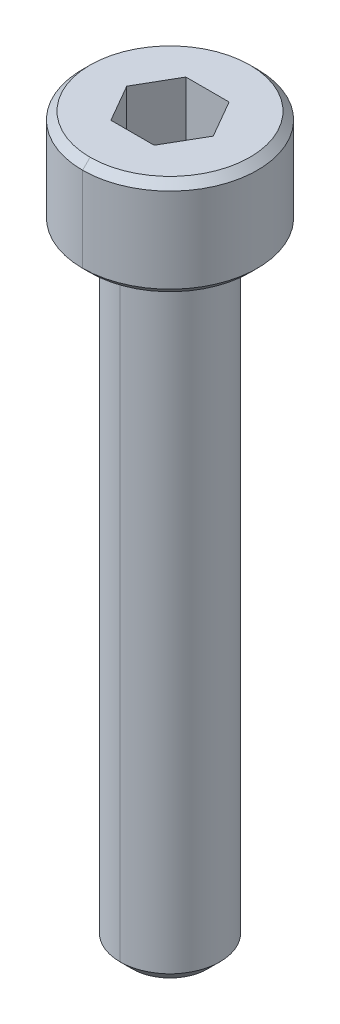
ISO-10303-21;
HEADER;
FILE_DESCRIPTION(('STEP AP214'),'2;1');
FILE_NAME('part.step','',(''),(''),'','','');
FILE_SCHEMA(('AUTOMOTIVE_DESIGN { 1 0 10303 214 1 1 1 1 }'));
ENDSEC;
DATA;
#1=APPLICATION_CONTEXT('core data for automotive mechanical design processes');
#2=APPLICATION_PROTOCOL_DEFINITION('international standard','automotive_design',2000,#1);
#3=PRODUCT_CONTEXT('',#1,'mechanical');
#4=PRODUCT('Part','Part','',(#3));
#5=PRODUCT_RELATED_PRODUCT_CATEGORY('part','',(#4));
#6=PRODUCT_DEFINITION_FORMATION('','',#4);
#7=PRODUCT_DEFINITION_CONTEXT('part definition',#1,'design');
#8=PRODUCT_DEFINITION('design','',#6,#7);
#9=PRODUCT_DEFINITION_SHAPE('','',#8);
#10=(LENGTH_UNIT() NAMED_UNIT(*) SI_UNIT(.MILLI.,.METRE.));
#11=(NAMED_UNIT(*) PLANE_ANGLE_UNIT() SI_UNIT($,.RADIAN.));
#12=(NAMED_UNIT(*) SI_UNIT($,.STERADIAN.) SOLID_ANGLE_UNIT());
#13=UNCERTAINTY_MEASURE_WITH_UNIT(LENGTH_MEASURE(1.E-05),#10,'distance_accuracy_value','');
#14=(GEOMETRIC_REPRESENTATION_CONTEXT(3) GLOBAL_UNCERTAINTY_ASSIGNED_CONTEXT((#13)) GLOBAL_UNIT_ASSIGNED_CONTEXT((#10,
#11,#12)) REPRESENTATION_CONTEXT('',''));
#15=CARTESIAN_POINT('',(0.,0.,0.));
#16=DIRECTION('',(0.,0.,1.));
#17=DIRECTION('',(1.,0.,0.));
#18=AXIS2_PLACEMENT_3D('',#15,#16,#17);
#19=CARTESIAN_POINT('',(0.866025403784439,26.,1.5));
#20=DIRECTION('',(0.866025403784439,0.,0.5));
#21=DIRECTION('',(0.5,0.,-0.866025403784439));
#22=AXIS2_PLACEMENT_3D('',#19,#20,#21);
#23=PLANE('',#22);
#24=DIRECTION('',(0.5,0.,-0.866025403784439));
#25=VECTOR('',#24,1.);
#26=CARTESIAN_POINT('',(0.866025403784439,26.,1.5));
#27=LINE('',#26,#25);
#28=CARTESIAN_POINT('',(0.866025403784439,26.,1.5));
#29=VERTEX_POINT('',#28);
#30=CARTESIAN_POINT('',(1.73205080756888,26.,0.));
#31=VERTEX_POINT('',#30);
#32=EDGE_CURVE('E179',#29,#31,#27,.T.);
#33=ORIENTED_EDGE('',*,*,#32,.F.);
#34=DIRECTION('',(0.,1.,0.));
#35=VECTOR('',#34,1.);
#36=CARTESIAN_POINT('',(0.866025403784439,26.,1.5));
#37=LINE('',#36,#35);
#38=CARTESIAN_POINT('',(0.866025403784439,29.,1.5));
#39=VERTEX_POINT('',#38);
#40=EDGE_CURVE('E167',#29,#39,#37,.T.);
#41=ORIENTED_EDGE('',*,*,#40,.T.);
#42=DIRECTION('',(0.5,0.,-0.866025403784439));
#43=VECTOR('',#42,1.);
#44=CARTESIAN_POINT('',(0.866025403784439,29.,1.5));
#45=LINE('',#44,#43);
#46=CARTESIAN_POINT('',(1.73205080756888,29.,0.));
#47=VERTEX_POINT('',#46);
#48=EDGE_CURVE('E181',#47,#39,#45,.F.);
#49=ORIENTED_EDGE('',*,*,#48,.F.);
#50=DIRECTION('',(0.,1.,0.));
#51=VECTOR('',#50,1.);
#52=CARTESIAN_POINT('',(1.73205080756888,26.,0.));
#53=LINE('',#52,#51);
#54=EDGE_CURVE('E174',#47,#31,#53,.F.);
#55=ORIENTED_EDGE('',*,*,#54,.T.);
#56=EDGE_LOOP('',(#33,#41,#49,#55));
#57=FACE_BOUND('',#56,.T.);
#58=ADVANCED_FACE('F17',(#57),#23,.F.);
#59=CARTESIAN_POINT('',(1.73205080756888,26.,0.));
#60=DIRECTION('',(0.866025403784438,0.,-0.5));
#61=DIRECTION('',(-0.5,0.,-0.866025403784438));
#62=AXIS2_PLACEMENT_3D('',#59,#60,#61);
#63=PLANE('',#62);
#64=DIRECTION('',(-0.5,0.,-0.866025403784438));
#65=VECTOR('',#64,1.);
#66=CARTESIAN_POINT('',(1.73205080756888,26.,0.));
#67=LINE('',#66,#65);
#68=CARTESIAN_POINT('',(0.866025403784438,26.,-1.5));
#69=VERTEX_POINT('',#68);
#70=EDGE_CURVE('E172',#31,#69,#67,.T.);
#71=ORIENTED_EDGE('',*,*,#70,.F.);
#72=ORIENTED_EDGE('',*,*,#54,.F.);
#73=DIRECTION('',(-0.5,0.,-0.866025403784438));
#74=VECTOR('',#73,1.);
#75=CARTESIAN_POINT('',(1.73205080756888,29.,0.));
#76=LINE('',#75,#74);
#77=CARTESIAN_POINT('',(0.866025403784439,29.,-1.5));
#78=VERTEX_POINT('',#77);
#79=EDGE_CURVE('E177',#78,#47,#76,.F.);
#80=ORIENTED_EDGE('',*,*,#79,.F.);
#81=DIRECTION('',(0.,1.,0.));
#82=VECTOR('',#81,1.);
#83=CARTESIAN_POINT('',(0.866025403784438,26.,-1.5));
#84=LINE('',#83,#82);
#85=EDGE_CURVE('E162',#78,#69,#84,.F.);
#86=ORIENTED_EDGE('',*,*,#85,.T.);
#87=EDGE_LOOP('',(#71,#72,#80,#86));
#88=FACE_BOUND('',#87,.T.);
#89=ADVANCED_FACE('F417',(#88),#63,.F.);
#90=CARTESIAN_POINT('',(-0.866025403784438,26.,1.5));
#91=DIRECTION('',(0.,0.,1.));
#92=DIRECTION('',(1.,0.,0.));
#93=AXIS2_PLACEMENT_3D('',#90,#91,#92);
#94=PLANE('',#93);
#95=DIRECTION('',(1.,0.,0.));
#96=VECTOR('',#95,1.);
#97=CARTESIAN_POINT('',(1.73205080756888,26.,1.5));
#98=LINE('',#97,#96);
#99=CARTESIAN_POINT('',(-0.866025403784438,26.,1.5));
#100=VERTEX_POINT('',#99);
#101=EDGE_CURVE('E159',#100,#29,#98,.T.);
#102=ORIENTED_EDGE('',*,*,#101,.F.);
#103=DIRECTION('',(0.,1.,0.));
#104=VECTOR('',#103,1.);
#105=CARTESIAN_POINT('',(-0.866025403784438,26.,1.5));
#106=LINE('',#105,#104);
#107=CARTESIAN_POINT('',(-0.866025403784438,29.,1.5));
#108=VERTEX_POINT('',#107);
#109=EDGE_CURVE('E148',#100,#108,#106,.T.);
#110=ORIENTED_EDGE('',*,*,#109,.T.);
#111=DIRECTION('',(1.,0.,0.));
#112=VECTOR('',#111,1.);
#113=CARTESIAN_POINT('',(-0.866025403784438,29.,1.5));
#114=LINE('',#113,#112);
#115=EDGE_CURVE('E170',#39,#108,#114,.F.);
#116=ORIENTED_EDGE('',*,*,#115,.F.);
#117=ORIENTED_EDGE('',*,*,#40,.F.);
#118=EDGE_LOOP('',(#102,#110,#116,#117));
#119=FACE_BOUND('',#118,.T.);
#120=ADVANCED_FACE('F408',(#119),#94,.F.);
#121=CARTESIAN_POINT('',(0.866025403784438,26.,-1.5));
#122=DIRECTION('',(0.,0.,-1.));
#123=DIRECTION('',(-1.,0.,0.));
#124=AXIS2_PLACEMENT_3D('',#121,#122,#123);
#125=PLANE('',#124);
#126=DIRECTION('',(1.,0.,0.));
#127=VECTOR('',#126,1.);
#128=CARTESIAN_POINT('',(1.73205080756888,26.,-1.5));
#129=LINE('',#128,#127);
#130=CARTESIAN_POINT('',(-0.866025403784438,26.,-1.5));
#131=VERTEX_POINT('',#130);
#132=EDGE_CURVE('E156',#69,#131,#129,.F.);
#133=ORIENTED_EDGE('',*,*,#132,.F.);
#134=ORIENTED_EDGE('',*,*,#85,.F.);
#135=DIRECTION('',(-1.,0.,0.));
#136=VECTOR('',#135,1.);
#137=CARTESIAN_POINT('',(0.866025403784438,29.,-1.5));
#138=LINE('',#137,#136);
#139=CARTESIAN_POINT('',(-0.866025403784438,29.,-1.5));
#140=VERTEX_POINT('',#139);
#141=EDGE_CURVE('E165',#140,#78,#138,.F.);
#142=ORIENTED_EDGE('',*,*,#141,.F.);
#143=DIRECTION('',(0.,1.,0.));
#144=VECTOR('',#143,1.);
#145=CARTESIAN_POINT('',(-0.866025403784438,26.,-1.5));
#146=LINE('',#145,#144);
#147=EDGE_CURVE('E146',#140,#131,#146,.F.);
#148=ORIENTED_EDGE('',*,*,#147,.T.);
#149=EDGE_LOOP('',(#133,#134,#142,#148));
#150=FACE_BOUND('',#149,.T.);
#151=ADVANCED_FACE('F399',(#150),#125,.F.);
#152=CARTESIAN_POINT('',(1.73205080756888,26.,0.));
#153=DIRECTION('',(0.,1.,0.));
#154=DIRECTION('',(0.,0.,1.));
#155=AXIS2_PLACEMENT_3D('',#152,#153,#154);
#156=PLANE('',#155);
#157=ORIENTED_EDGE('',*,*,#132,.T.);
#158=DIRECTION('',(-0.5,0.,0.866025403784439));
#159=VECTOR('',#158,1.);
#160=CARTESIAN_POINT('',(-0.866025403784438,26.,-1.5));
#161=LINE('',#160,#159);
#162=CARTESIAN_POINT('',(-1.73205080756888,26.,0.));
#163=VERTEX_POINT('',#162);
#164=EDGE_CURVE('E144',#131,#163,#161,.T.);
#165=ORIENTED_EDGE('',*,*,#164,.T.);
#166=DIRECTION('',(0.5,0.,0.866025403784439));
#167=VECTOR('',#166,1.);
#168=CARTESIAN_POINT('',(-1.73205080756888,26.,0.));
#169=LINE('',#168,#167);
#170=EDGE_CURVE('E151',#163,#100,#169,.T.);
#171=ORIENTED_EDGE('',*,*,#170,.T.);
#172=ORIENTED_EDGE('',*,*,#101,.T.);
#173=ORIENTED_EDGE('',*,*,#32,.T.);
#174=ORIENTED_EDGE('',*,*,#70,.T.);
#175=EDGE_LOOP('',(#157,#165,#171,#172,#173,#174));
#176=FACE_BOUND('',#175,.T.);
#177=ADVANCED_FACE('F390',(#176),#156,.T.);
#178=CARTESIAN_POINT('',(-1.73205080756888,26.,0.));
#179=DIRECTION('',(-0.866025403784439,0.,0.5));
#180=DIRECTION('',(0.5,0.,0.866025403784439));
#181=AXIS2_PLACEMENT_3D('',#178,#179,#180);
#182=PLANE('',#181);
#183=ORIENTED_EDGE('',*,*,#170,.F.);
#184=DIRECTION('',(0.,1.,0.));
#185=VECTOR('',#184,1.);
#186=CARTESIAN_POINT('',(-1.73205080756888,26.,0.));
#187=LINE('',#186,#185);
#188=CARTESIAN_POINT('',(-1.73205080756888,29.,0.));
#189=VERTEX_POINT('',#188);
#190=EDGE_CURVE('E141',#163,#189,#187,.T.);
#191=ORIENTED_EDGE('',*,*,#190,.T.);
#192=DIRECTION('',(0.5,0.,0.866025403784439));
#193=VECTOR('',#192,1.);
#194=CARTESIAN_POINT('',(-1.73205080756888,29.,0.));
#195=LINE('',#194,#193);
#196=EDGE_CURVE('E154',#108,#189,#195,.F.);
#197=ORIENTED_EDGE('',*,*,#196,.F.);
#198=ORIENTED_EDGE('',*,*,#109,.F.);
#199=EDGE_LOOP('',(#183,#191,#197,#198));
#200=FACE_BOUND('',#199,.T.);
#201=ADVANCED_FACE('F381',(#200),#182,.F.);
#202=CARTESIAN_POINT('',(-0.866025403784438,26.,-1.5));
#203=DIRECTION('',(-0.866025403784439,0.,-0.5));
#204=DIRECTION('',(-0.5,0.,0.866025403784439));
#205=AXIS2_PLACEMENT_3D('',#202,#203,#204);
#206=PLANE('',#205);
#207=ORIENTED_EDGE('',*,*,#164,.F.);
#208=ORIENTED_EDGE('',*,*,#147,.F.);
#209=DIRECTION('',(0.5,0.,-0.866025403784439));
#210=VECTOR('',#209,1.);
#211=CARTESIAN_POINT('',(-1.73205080756888,29.,0.));
#212=LINE('',#211,#210);
#213=EDGE_CURVE('E122',#189,#140,#212,.T.);
#214=ORIENTED_EDGE('',*,*,#213,.F.);
#215=ORIENTED_EDGE('',*,*,#190,.F.);
#216=EDGE_LOOP('',(#207,#208,#214,#215));
#217=FACE_BOUND('',#216,.T.);
#218=ADVANCED_FACE('F373',(#217),#206,.F.);
#219=CARTESIAN_POINT('',(0.,29.,-3.5));
#220=DIRECTION('',(0.,1.,0.));
#221=DIRECTION('',(0.,0.,1.));
#222=AXIS2_PLACEMENT_3D('',#219,#220,#221);
#223=PLANE('',#222);
#224=CARTESIAN_POINT('',(0.,29.0000000000532,0.));
#225=DIRECTION('',(0.,-1.,0.));
#226=DIRECTION('',(1.,0.,0.));
#227=AXIS2_PLACEMENT_3D('',#224,#225,#226);
#228=CIRCLE('',#227,3.19999999999254);
#229=CARTESIAN_POINT('',(0.,29.0000000000532,-3.19999999999254));
#230=VERTEX_POINT('',#229);
#231=CARTESIAN_POINT('',(0.,29.0000000000532,3.19999999999254));
#232=VERTEX_POINT('',#231);
#233=EDGE_CURVE('E111',#230,#232,#228,.T.);
#234=ORIENTED_EDGE('',*,*,#233,.F.);
#235=CARTESIAN_POINT('',(0.,29.0000000000532,0.));
#236=DIRECTION('',(0.,-1.,0.));
#237=DIRECTION('',(1.,0.,0.));
#238=AXIS2_PLACEMENT_3D('',#235,#236,#237);
#239=CIRCLE('',#238,3.19999999999254);
#240=EDGE_CURVE('E20',#232,#230,#239,.T.);
#241=ORIENTED_EDGE('',*,*,#240,.F.);
#242=EDGE_LOOP('',(#234,#241));
#243=FACE_BOUND('',#242,.T.);
#244=ORIENTED_EDGE('',*,*,#196,.T.);
#245=ORIENTED_EDGE('',*,*,#213,.T.);
#246=ORIENTED_EDGE('',*,*,#141,.T.);
#247=ORIENTED_EDGE('',*,*,#79,.T.);
#248=ORIENTED_EDGE('',*,*,#48,.T.);
#249=ORIENTED_EDGE('',*,*,#115,.T.);
#250=EDGE_LOOP('',(#244,#245,#246,#247,#248,#249));
#251=FACE_BOUND('',#250,.T.);
#252=ADVANCED_FACE('F112',(#243,#251),#223,.T.);
#253=CARTESIAN_POINT('',(0.,28.7000000000717,0.));
#254=DIRECTION('',(0.,-1.,0.));
#255=DIRECTION('',(1.,0.,0.));
#256=AXIS2_PLACEMENT_3D('',#253,#254,#255);
#257=CONICAL_SURFACE('',#256,3.49999999997408,0.785398163397448);
#258=DIRECTION('',(0.,0.707106781186548,0.707106781186548));
#259=VECTOR('',#258,1.);
#260=CARTESIAN_POINT('',(0.,-498967.8,-499000.));
#261=LINE('',#260,#259);
#262=CARTESIAN_POINT('',(0.,28.7000000000179,-3.49999999999352));
#263=VERTEX_POINT('',#262);
#264=EDGE_CURVE('E120',#263,#230,#261,.T.);
#265=ORIENTED_EDGE('',*,*,#264,.F.);
#266=CARTESIAN_POINT('',(0.,28.7,0.));
#267=DIRECTION('',(0.,-1.,0.));
#268=DIRECTION('',(0.,0.,-1.));
#269=AXIS2_PLACEMENT_3D('',#266,#267,#268);
#270=CIRCLE('',#269,3.5);
#271=CARTESIAN_POINT('',(0.,28.7000000000179,3.49999999999352));
#272=VERTEX_POINT('',#271);
#273=EDGE_CURVE('E127',#272,#263,#270,.T.);
#274=ORIENTED_EDGE('',*,*,#273,.F.);
#275=DIRECTION('',(0.,0.707106781186548,-0.707106781186548));
#276=VECTOR('',#275,1.);
#277=CARTESIAN_POINT('',(6.11098752774529E-11,-498967.8,499000.));
#278=LINE('',#277,#276);
#279=EDGE_CURVE('E117',#232,#272,#278,.F.);
#280=ORIENTED_EDGE('',*,*,#279,.F.);
#281=ORIENTED_EDGE('',*,*,#240,.T.);
#282=EDGE_LOOP('',(#265,#274,#280,#281));
#283=FACE_BOUND('',#282,.T.);
#284=ADVANCED_FACE('F119',(#283),#257,.T.);
#285=CARTESIAN_POINT('',(0.,28.7000000000717,0.));
#286=DIRECTION('',(0.,-1.,0.));
#287=DIRECTION('',(1.,0.,0.));
#288=AXIS2_PLACEMENT_3D('',#285,#286,#287);
#289=CONICAL_SURFACE('',#288,3.49999999997408,0.785398163397448);
#290=CARTESIAN_POINT('',(0.,28.7,0.));
#291=DIRECTION('',(0.,-1.,0.));
#292=DIRECTION('',(0.,0.,-1.));
#293=AXIS2_PLACEMENT_3D('',#290,#291,#292);
#294=CIRCLE('',#293,3.5);
#295=EDGE_CURVE('E125',#263,#272,#294,.T.);
#296=ORIENTED_EDGE('',*,*,#295,.F.);
#297=ORIENTED_EDGE('',*,*,#264,.T.);
#298=ORIENTED_EDGE('',*,*,#233,.T.);
#299=ORIENTED_EDGE('',*,*,#279,.T.);
#300=EDGE_LOOP('',(#296,#297,#298,#299));
#301=FACE_BOUND('',#300,.T.);
#302=ADVANCED_FACE('F123',(#301),#289,.T.);
#303=CARTESIAN_POINT('',(0.,0.,0.));
#304=DIRECTION('',(0.,-1.,0.));
#305=DIRECTION('',(0.,0.,-1.));
#306=AXIS2_PLACEMENT_3D('',#303,#304,#305);
#307=CYLINDRICAL_SURFACE('',#306,3.5);
#308=DIRECTION('',(0.,-1.,0.));
#309=VECTOR('',#308,1.);
#310=CARTESIAN_POINT('',(0.,0.,-3.5));
#311=LINE('',#310,#309);
#312=CARTESIAN_POINT('',(0.,25.2999999999375,-3.49999999996635));
#313=VERTEX_POINT('',#312);
#314=EDGE_CURVE('E226',#313,#263,#311,.F.);
#315=ORIENTED_EDGE('',*,*,#314,.F.);
#316=CARTESIAN_POINT('',(0.,25.2999999999588,0.));
#317=DIRECTION('',(0.,1.,0.));
#318=DIRECTION('',(0.,0.,1.));
#319=AXIS2_PLACEMENT_3D('',#316,#317,#318);
#320=CIRCLE('',#319,3.49999999997408);
#321=CARTESIAN_POINT('',(0.,25.2999999999588,3.49999999996635));
#322=VERTEX_POINT('',#321);
#323=EDGE_CURVE('E221',#322,#313,#320,.F.);
#324=ORIENTED_EDGE('',*,*,#323,.F.);
#325=DIRECTION('',(0.,-1.,0.));
#326=VECTOR('',#325,1.);
#327=CARTESIAN_POINT('',(0.,0.,3.5));
#328=LINE('',#327,#326);
#329=EDGE_CURVE('E231',#272,#322,#328,.T.);
#330=ORIENTED_EDGE('',*,*,#329,.F.);
#331=ORIENTED_EDGE('',*,*,#273,.T.);
#332=EDGE_LOOP('',(#315,#324,#330,#331));
#333=FACE_BOUND('',#332,.T.);
#334=ADVANCED_FACE('F246',(#333),#307,.T.);
#335=CARTESIAN_POINT('',(0.,0.,0.));
#336=DIRECTION('',(0.,-1.,0.));
#337=DIRECTION('',(0.,0.,-1.));
#338=AXIS2_PLACEMENT_3D('',#335,#336,#337);
#339=CYLINDRICAL_SURFACE('',#338,3.5);
#340=CARTESIAN_POINT('',(0.,25.2999999999588,0.));
#341=DIRECTION('',(0.,1.,0.));
#342=DIRECTION('',(0.,0.,1.));
#343=AXIS2_PLACEMENT_3D('',#340,#341,#342);
#344=CIRCLE('',#343,3.49999999997408);
#345=EDGE_CURVE('E206',#313,#322,#344,.F.);
#346=ORIENTED_EDGE('',*,*,#345,.F.);
#347=ORIENTED_EDGE('',*,*,#314,.T.);
#348=ORIENTED_EDGE('',*,*,#295,.T.);
#349=ORIENTED_EDGE('',*,*,#329,.T.);
#350=EDGE_LOOP('',(#346,#347,#348,#349));
#351=FACE_BOUND('',#350,.T.);
#352=ADVANCED_FACE('F243',(#351),#339,.T.);
#353=CARTESIAN_POINT('',(0.,25.299999999902,0.));
#354=DIRECTION('',(0.,1.,0.));
#355=DIRECTION('',(0.,0.,1.));
#356=AXIS2_PLACEMENT_3D('',#353,#354,#355);
#357=CONICAL_SURFACE('',#356,3.49999999991724,0.785398163397448);
#358=DIRECTION('',(0.,-0.707106781186548,-0.707106781186548));
#359=VECTOR('',#358,1.);
#360=CARTESIAN_POINT('',(0.,499000.,498978.2));
#361=LINE('',#360,#359);
#362=CARTESIAN_POINT('',(0.,24.9999999999773,3.19999999999254));
#363=VERTEX_POINT('',#362);
#364=EDGE_CURVE('E203',#322,#363,#361,.T.);
#365=ORIENTED_EDGE('',*,*,#364,.F.);
#366=ORIENTED_EDGE('',*,*,#323,.T.);
#367=DIRECTION('',(0.,-0.707106781186548,0.707106781186548));
#368=VECTOR('',#367,1.);
#369=CARTESIAN_POINT('',(6.11072055474308E-11,499000.,-498978.2));
#370=LINE('',#369,#368);
#371=CARTESIAN_POINT('',(0.,24.9999999999773,-3.19999999999254));
#372=VERTEX_POINT('',#371);
#373=EDGE_CURVE('E212',#372,#313,#370,.F.);
#374=ORIENTED_EDGE('',*,*,#373,.F.);
#375=CARTESIAN_POINT('',(0.,24.9999999999773,0.));
#376=DIRECTION('',(0.,1.,0.));
#377=DIRECTION('',(0.,0.,1.));
#378=AXIS2_PLACEMENT_3D('',#375,#376,#377);
#379=CIRCLE('',#378,3.19999999999254);
#380=EDGE_CURVE('E198',#363,#372,#379,.F.);
#381=ORIENTED_EDGE('',*,*,#380,.F.);
#382=EDGE_LOOP('',(#365,#366,#374,#381));
#383=FACE_BOUND('',#382,.T.);
#384=ADVANCED_FACE('F248',(#383),#357,.T.);
#385=CARTESIAN_POINT('',(0.,25.299999999902,0.));
#386=DIRECTION('',(0.,1.,0.));
#387=DIRECTION('',(0.,0.,1.));
#388=AXIS2_PLACEMENT_3D('',#385,#386,#387);
#389=CONICAL_SURFACE('',#388,3.49999999991724,0.785398163397448);
#390=ORIENTED_EDGE('',*,*,#345,.T.);
#391=ORIENTED_EDGE('',*,*,#364,.T.);
#392=CARTESIAN_POINT('',(0.,24.9999999999773,0.));
#393=DIRECTION('',(0.,1.,0.));
#394=DIRECTION('',(0.,0.,1.));
#395=AXIS2_PLACEMENT_3D('',#392,#393,#394);
#396=CIRCLE('',#395,3.19999999999254);
#397=EDGE_CURVE('E195',#372,#363,#396,.F.);
#398=ORIENTED_EDGE('',*,*,#397,.F.);
#399=ORIENTED_EDGE('',*,*,#373,.T.);
#400=EDGE_LOOP('',(#390,#391,#398,#399));
#401=FACE_BOUND('',#400,.T.);
#402=ADVANCED_FACE('F249',(#401),#389,.T.);
#403=CARTESIAN_POINT('',(0.,0.,0.));
#404=DIRECTION('',(0.,-1.,0.));
#405=DIRECTION('',(0.,0.,-1.));
#406=AXIS2_PLACEMENT_3D('',#403,#404,#405);
#407=PLANE('',#406);
#408=CARTESIAN_POINT('',(0.,5.68433104405908E-11,0.));
#409=DIRECTION('',(0.,1.,0.));
#410=DIRECTION('',(0.,0.,1.));
#411=AXIS2_PLACEMENT_3D('',#408,#409,#410);
#412=CIRCLE('',#411,1.50000000002137);
#413=CARTESIAN_POINT('',(0.,5.68433104405908E-11,1.50000000002137));
#414=VERTEX_POINT('',#413);
#415=CARTESIAN_POINT('',(0.,5.68433104405908E-11,-1.50000000002137));
#416=VERTEX_POINT('',#415);
#417=EDGE_CURVE('E191',#414,#416,#412,.T.);
#418=ORIENTED_EDGE('',*,*,#417,.F.);
#419=CARTESIAN_POINT('',(0.,5.68433104405908E-11,0.));
#420=DIRECTION('',(0.,1.,0.));
#421=DIRECTION('',(0.,0.,1.));
#422=AXIS2_PLACEMENT_3D('',#419,#420,#421);
#423=CIRCLE('',#422,1.50000000002137);
#424=EDGE_CURVE('E201',#416,#414,#423,.T.);
#425=ORIENTED_EDGE('',*,*,#424,.F.);
#426=EDGE_LOOP('',(#418,#425));
#427=FACE_BOUND('',#426,.T.);
#428=ADVANCED_FACE('F271',(#427),#407,.T.);
#429=CARTESIAN_POINT('',(0.,0.49999999987449,0.));
#430=DIRECTION('',(0.,1.,0.));
#431=DIRECTION('',(0.,0.,1.));
#432=AXIS2_PLACEMENT_3D('',#429,#430,#431);
#433=CONICAL_SURFACE('',#432,1.99999999989586,0.785398163454292);
#434=DIRECTION('',(0.,-0.707106781146353,-0.707106781226742));
#435=VECTOR('',#434,1.);
#436=CARTESIAN_POINT('',(0.,498998.49994327,499000.));
#437=LINE('',#436,#435);
#438=CARTESIAN_POINT('',(0.,0.499999999992614,2.00000000000597));
#439=VERTEX_POINT('',#438);
#440=EDGE_CURVE('E190',#439,#414,#437,.T.);
#441=ORIENTED_EDGE('',*,*,#440,.F.);
#442=CARTESIAN_POINT('',(0.,0.500000000000009,0.));
#443=DIRECTION('',(0.,-1.,0.));
#444=DIRECTION('',(0.,0.,-1.));
#445=AXIS2_PLACEMENT_3D('',#442,#443,#444);
#446=CIRCLE('',#445,2.);
#447=CARTESIAN_POINT('',(0.,0.499999999991135,-2.00000000000716));
#448=VERTEX_POINT('',#447);
#449=EDGE_CURVE('E35',#448,#439,#446,.F.);
#450=ORIENTED_EDGE('',*,*,#449,.F.);
#451=DIRECTION('',(0.,-0.707106781146353,0.707106781226742));
#452=VECTOR('',#451,1.);
#453=CARTESIAN_POINT('',(6.11098752774529E-11,498998.49994327,-499000.));
#454=LINE('',#453,#452);
#455=EDGE_CURVE('E194',#416,#448,#454,.F.);
#456=ORIENTED_EDGE('',*,*,#455,.F.);
#457=ORIENTED_EDGE('',*,*,#424,.T.);
#458=EDGE_LOOP('',(#441,#450,#456,#457));
#459=FACE_BOUND('',#458,.T.);
#460=ADVANCED_FACE('F255',(#459),#433,.T.);
#461=CARTESIAN_POINT('',(0.,25.,-2.));
#462=DIRECTION('',(0.,-1.,0.));
#463=DIRECTION('',(0.,0.,-1.));
#464=AXIS2_PLACEMENT_3D('',#461,#462,#463);
#465=PLANE('',#464);
#466=ORIENTED_EDGE('',*,*,#380,.T.);
#467=ORIENTED_EDGE('',*,*,#397,.T.);
#468=EDGE_LOOP('',(#466,#467));
#469=FACE_BOUND('',#468,.T.);
#470=CARTESIAN_POINT('',(0.,25.,0.));
#471=DIRECTION('',(0.,-1.,0.));
#472=DIRECTION('',(0.,0.,-1.));
#473=AXIS2_PLACEMENT_3D('',#470,#471,#472);
#474=CIRCLE('',#473,2.);
#475=CARTESIAN_POINT('',(0.,25.,-2.));
#476=VERTEX_POINT('',#475);
#477=CARTESIAN_POINT('',(0.,25.,2.));
#478=VERTEX_POINT('',#477);
#479=EDGE_CURVE('E183',#476,#478,#474,.T.);
#480=ORIENTED_EDGE('',*,*,#479,.F.);
#481=CARTESIAN_POINT('',(0.,25.,0.));
#482=DIRECTION('',(0.,-1.,0.));
#483=DIRECTION('',(0.,0.,-1.));
#484=AXIS2_PLACEMENT_3D('',#481,#482,#483);
#485=CIRCLE('',#484,2.);
#486=EDGE_CURVE('E187',#478,#476,#485,.T.);
#487=ORIENTED_EDGE('',*,*,#486,.F.);
#488=EDGE_LOOP('',(#480,#487));
#489=FACE_BOUND('',#488,.T.);
#490=ADVANCED_FACE('F251',(#469,#489),#465,.T.);
#491=CARTESIAN_POINT('',(0.,0.49999999987449,0.));
#492=DIRECTION('',(0.,1.,0.));
#493=DIRECTION('',(0.,0.,1.));
#494=AXIS2_PLACEMENT_3D('',#491,#492,#493);
#495=CONICAL_SURFACE('',#494,1.99999999989586,0.785398163454292);
#496=CARTESIAN_POINT('',(0.,0.500000000000009,0.));
#497=DIRECTION('',(0.,-1.,0.));
#498=DIRECTION('',(0.,0.,-1.));
#499=AXIS2_PLACEMENT_3D('',#496,#497,#498);
#500=CIRCLE('',#499,2.);
#501=EDGE_CURVE('E26',#439,#448,#500,.F.);
#502=ORIENTED_EDGE('',*,*,#501,.F.);
#503=ORIENTED_EDGE('',*,*,#440,.T.);
#504=ORIENTED_EDGE('',*,*,#417,.T.);
#505=ORIENTED_EDGE('',*,*,#455,.T.);
#506=EDGE_LOOP('',(#502,#503,#504,#505));
#507=FACE_BOUND('',#506,.T.);
#508=ADVANCED_FACE('F254',(#507),#495,.T.);
#509=CARTESIAN_POINT('',(0.,0.,0.));
#510=DIRECTION('',(0.,-1.,0.));
#511=DIRECTION('',(0.,0.,-1.));
#512=AXIS2_PLACEMENT_3D('',#509,#510,#511);
#513=CYLINDRICAL_SURFACE('',#512,2.);
#514=DIRECTION('',(0.,-1.,0.));
#515=VECTOR('',#514,1.);
#516=CARTESIAN_POINT('',(0.,0.,-2.));
#517=LINE('',#516,#515);
#518=EDGE_CURVE('E11',#448,#476,#517,.F.);
#519=ORIENTED_EDGE('',*,*,#518,.F.);
#520=ORIENTED_EDGE('',*,*,#449,.T.);
#521=DIRECTION('',(0.,-1.,0.));
#522=VECTOR('',#521,1.);
#523=CARTESIAN_POINT('',(0.,0.,2.));
#524=LINE('',#523,#522);
#525=EDGE_CURVE('E186',#478,#439,#524,.T.);
#526=ORIENTED_EDGE('',*,*,#525,.F.);
#527=ORIENTED_EDGE('',*,*,#486,.T.);
#528=EDGE_LOOP('',(#519,#520,#526,#527));
#529=FACE_BOUND('',#528,.T.);
#530=ADVANCED_FACE('F262',(#529),#513,.T.);
#531=CARTESIAN_POINT('',(0.,0.,0.));
#532=DIRECTION('',(0.,-1.,0.));
#533=DIRECTION('',(0.,0.,-1.));
#534=AXIS2_PLACEMENT_3D('',#531,#532,#533);
#535=CYLINDRICAL_SURFACE('',#534,2.);
#536=ORIENTED_EDGE('',*,*,#501,.T.);
#537=ORIENTED_EDGE('',*,*,#518,.T.);
#538=ORIENTED_EDGE('',*,*,#479,.T.);
#539=ORIENTED_EDGE('',*,*,#525,.T.);
#540=EDGE_LOOP('',(#536,#537,#538,#539));
#541=FACE_BOUND('',#540,.T.);
#542=ADVANCED_FACE('F264',(#541),#535,.T.);
#543=CLOSED_SHELL('',(#58,#89,#120,#151,#177,#201,#218,#252,#284,#302,#334,#352,#384,#402,#428,
#460,#490,#508,#530,#542));
#544=MANIFOLD_SOLID_BREP('B1',#543);
#545=ADVANCED_BREP_SHAPE_REPRESENTATION('',(#18,#544),#14);
#546=SHAPE_DEFINITION_REPRESENTATION(#9,#545);
ENDSEC;
END-ISO-10303-21;
